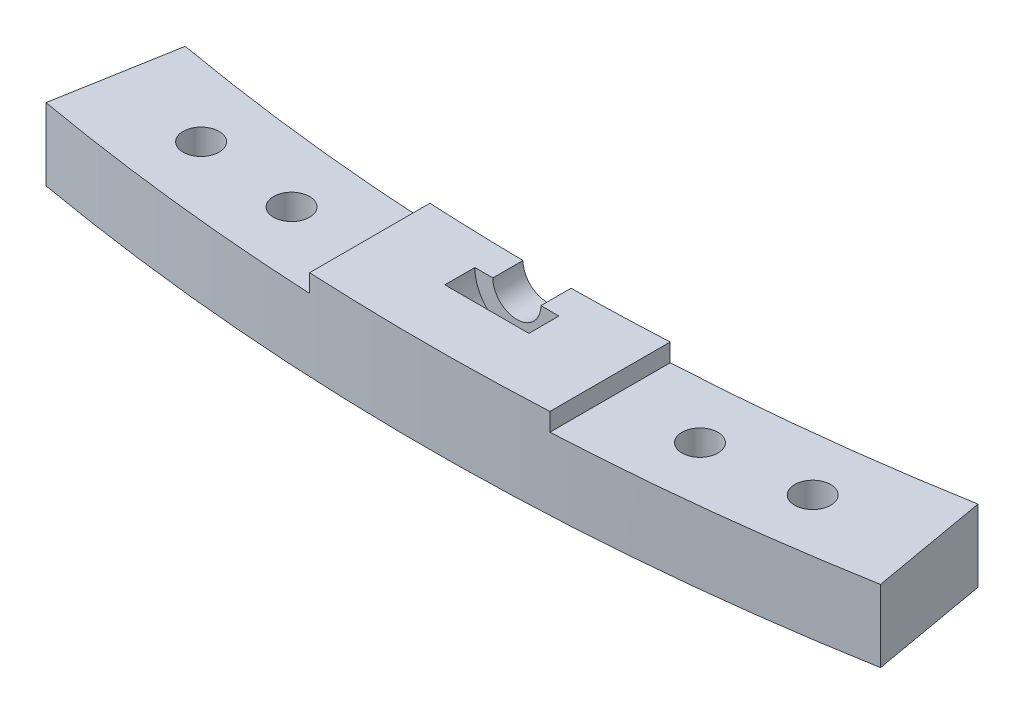
ISO-10303-21;
HEADER;
FILE_DESCRIPTION(('STEP AP214'),'2;1');
FILE_NAME('part.step','',(''),(''),'','','');
FILE_SCHEMA(('AUTOMOTIVE_DESIGN { 1 0 10303 214 1 1 1 1 }'));
ENDSEC;
DATA;
#1=APPLICATION_CONTEXT('core data for automotive mechanical design processes');
#2=APPLICATION_PROTOCOL_DEFINITION('international standard','automotive_design',2000,#1);
#3=PRODUCT_CONTEXT('',#1,'mechanical');
#4=PRODUCT('Part','Part','',(#3));
#5=PRODUCT_RELATED_PRODUCT_CATEGORY('part','',(#4));
#6=PRODUCT_DEFINITION_FORMATION('','',#4);
#7=PRODUCT_DEFINITION_CONTEXT('part definition',#1,'design');
#8=PRODUCT_DEFINITION('design','',#6,#7);
#9=PRODUCT_DEFINITION_SHAPE('','',#8);
#10=(LENGTH_UNIT() NAMED_UNIT(*) SI_UNIT(.MILLI.,.METRE.));
#11=(NAMED_UNIT(*) PLANE_ANGLE_UNIT() SI_UNIT($,.RADIAN.));
#12=(NAMED_UNIT(*) SI_UNIT($,.STERADIAN.) SOLID_ANGLE_UNIT());
#13=UNCERTAINTY_MEASURE_WITH_UNIT(LENGTH_MEASURE(1.E-05),#10,'distance_accuracy_value','');
#14=(GEOMETRIC_REPRESENTATION_CONTEXT(3) GLOBAL_UNCERTAINTY_ASSIGNED_CONTEXT((#13)) GLOBAL_UNIT_ASSIGNED_CONTEXT((#10,
#11,#12)) REPRESENTATION_CONTEXT('',''));
#15=CARTESIAN_POINT('',(0.,0.,0.));
#16=DIRECTION('',(0.,0.,1.));
#17=DIRECTION('',(1.,0.,0.));
#18=AXIS2_PLACEMENT_3D('',#15,#16,#17);
#19=CARTESIAN_POINT('',(0.,26.2710772670793,0.));
#20=DIRECTION('',(0.,-1.,0.));
#21=DIRECTION('',(0.,0.,-1.));
#22=AXIS2_PLACEMENT_3D('',#19,#20,#21);
#23=CYLINDRICAL_SURFACE('',#22,190.);
#24=CARTESIAN_POINT('',(0.,0.,0.));
#25=DIRECTION('',(0.,1.,0.));
#26=DIRECTION('',(0.,0.,1.));
#27=AXIS2_PLACEMENT_3D('',#24,#25,#26);
#28=CIRCLE('',#27,190.);
#29=CARTESIAN_POINT('',(-9.99999999999934,0.,189.736659610103));
#30=VERTEX_POINT('',#29);
#31=CARTESIAN_POINT('',(-2.00000000002216,0.,189.989473392606));
#32=VERTEX_POINT('',#31);
#33=EDGE_CURVE('E244',#30,#32,#28,.T.);
#34=ORIENTED_EDGE('',*,*,#33,.T.);
#35=CARTESIAN_POINT('',(-2.00000000002216,0.,189.989473392606));
#36=CARTESIAN_POINT('',(-1.9999996282867,-0.0562663615670697,189.989473252533));
#37=CARTESIAN_POINT('',(-1.99762408328803,-0.112505764435227,189.989498419835));
#38=CARTESIAN_POINT('',(-1.98814707857346,-0.224582125160615,189.989597884489));
#39=CARTESIAN_POINT('',(-1.98104584610246,-0.280419102238858,189.989672179479));
#40=CARTESIAN_POINT('',(-1.9527201409285,-0.446634438283064,189.989966219135));
#41=CARTESIAN_POINT('',(-1.92447347974323,-0.555899318345152,189.99025712777));
#42=CARTESIAN_POINT('',(-1.8500390294585,-0.768130642504423,189.990996429958));
#43=CARTESIAN_POINT('',(-1.80384293568367,-0.87109414557802,189.9914448964));
#44=CARTESIAN_POINT('',(-1.69482723839045,-1.06779909976538,189.992448587563));
#45=CARTESIAN_POINT('',(-1.63201088707611,-1.1615423501542,189.993003791393));
#46=CARTESIAN_POINT('',(-1.49153066181438,-1.33715494905182,189.994158476217));
#47=CARTESIAN_POINT('',(-1.41386594827158,-1.41902362565643,189.994757959713));
#48=CARTESIAN_POINT('',(-1.24588210957246,-1.56857411653775,189.995933689787));
#49=CARTESIAN_POINT('',(-1.15556105909845,-1.63625376842261,189.996509932812));
#50=CARTESIAN_POINT('',(-0.964839585091913,-1.75548636143188,189.997574101544));
#51=CARTESIAN_POINT('',(-0.864439372486534,-1.80703963994086,189.998062029099));
#52=CARTESIAN_POINT('',(-0.656414780417413,-1.89255529004982,189.998894541149));
#53=CARTESIAN_POINT('',(-0.548790865230986,-1.92651879094844,189.999239134845));
#54=CARTESIAN_POINT('',(-0.329370090691648,-1.9758949923209,189.999746170821));
#55=CARTESIAN_POINT('',(-0.217573302686825,-1.9913080098226,189.999908616214));
#56=CARTESIAN_POINT('',(0.00702380769235231,-2.00314676029534,190.0000330534));
#57=CARTESIAN_POINT('',(0.119824152817121,-1.99957206171852,189.999995040636));
#58=CARTESIAN_POINT('',(0.343217864650816,-1.97353655628363,189.999722843588));
#59=CARTESIAN_POINT('',(0.453811340457094,-1.9510766854003,189.999488669025));
#60=CARTESIAN_POINT('',(0.669657459518345,-1.88790988084822,189.998850561368));
#61=CARTESIAN_POINT('',(0.774910119007805,-1.84720300264864,189.998446628791));
#62=CARTESIAN_POINT('',(0.977092273388018,-1.74869571914981,189.997514517664));
#63=CARTESIAN_POINT('',(1.0740213822973,-1.69089452170088,189.996986333358));
#64=CARTESIAN_POINT('',(1.25679535801308,-1.55984282904133,189.99586530116));
#65=CARTESIAN_POINT('',(1.34264076627679,-1.48659308897844,189.995272456429));
#66=CARTESIAN_POINT('',(1.50080978823435,-1.32673038056564,189.994088959047));
#67=CARTESIAN_POINT('',(1.57313456063506,-1.24011855849687,189.993498306211));
#68=CARTESIAN_POINT('',(1.70223997665121,-1.0559479997299,189.992385539032));
#69=CARTESIAN_POINT('',(1.75901567425644,-0.958385793701042,189.991863446525));
#70=CARTESIAN_POINT('',(1.85540843690939,-0.755072219097268,189.990946609874));
#71=CARTESIAN_POINT('',(1.89501503452869,-0.649315901022155,189.990551943457));
#72=CARTESIAN_POINT('',(1.95585005946302,-0.432736835672161,189.989935500477));
#73=CARTESIAN_POINT('',(1.97710655557743,-0.321922100269124,189.989713459915));
#74=CARTESIAN_POINT('',(1.99261372162719,-0.175308953622074,189.989551013711));
#75=CARTESIAN_POINT('',(1.99538503861373,-0.1402736331387,189.98952192059));
#76=CARTESIAN_POINT('',(1.99907564906491,-0.0701636046164072,189.989483136031));
#77=CARTESIAN_POINT('',(1.99999799703702,-0.0350890574736384,189.989473412594));
#78=CARTESIAN_POINT('',(2.00000000002216,0.,189.989473392607));
#79=B_SPLINE_CURVE_WITH_KNOTS('',3,(#35,#36,#37,#38,#39,#40,#41,#42,#43,#44,#45,#46,#47,#48,#49,
#50,#51,#52,#53,#54,#55,#56,#57,#58,#59,#60,#61,#62,#63,#64,#65,#66,#67,#68,#69,#70,#71,#72,#73,
#74,#75,#76,#77,#78),.UNSPECIFIED.,.F.,.F.,(4,2,2,2,2,2,2,2,2,2,2,2,2,2,2,2,2,2,2,2,2,4),(0.,
0.168695399034471,0.33738268657242,0.674217866919582,1.01120907694378,1.34813439420536,
1.68507876842809,2.02207445533745,2.35906309138994,2.69603008941987,3.03299132860003,
3.36996022617985,3.70691242410866,4.04386359774195,4.38083038811888,4.7177807108739,
5.0547021440253,5.39173062447491,5.72896429196624,6.06568119925835,6.17108150078959,
6.27630753644634),.UNSPECIFIED.);
#80=CARTESIAN_POINT('',(2.00000000002216,0.,189.989473392606));
#81=VERTEX_POINT('',#80);
#82=EDGE_CURVE('E52',#32,#81,#79,.T.);
#83=ORIENTED_EDGE('',*,*,#82,.T.);
#84=CARTESIAN_POINT('',(10.0000000000013,0.,189.736659610103));
#85=VERTEX_POINT('',#84);
#86=EDGE_CURVE('E249',#81,#85,#28,.T.);
#87=ORIENTED_EDGE('',*,*,#86,.T.);
#88=DIRECTION('',(0.,-1.,0.));
#89=VECTOR('',#88,1.);
#90=CARTESIAN_POINT('',(10.0000000000013,22.4796831819073,189.736659610103));
#91=LINE('',#90,#89);
#92=CARTESIAN_POINT('',(10.0000000000013,-1.5,189.736659610103));
#93=VERTEX_POINT('',#92);
#94=EDGE_CURVE('E248',#85,#93,#91,.T.);
#95=ORIENTED_EDGE('',*,*,#94,.T.);
#96=CARTESIAN_POINT('',(0.,-1.5,0.));
#97=DIRECTION('',(0.,1.,0.));
#98=DIRECTION('',(0.,0.,1.));
#99=AXIS2_PLACEMENT_3D('',#96,#97,#98);
#100=CIRCLE('',#99,190.);
#101=CARTESIAN_POINT('',(32.9931537567169,-1.5,187.113473072319));
#102=VERTEX_POINT('',#101);
#103=EDGE_CURVE('E60',#93,#102,#100,.T.);
#104=ORIENTED_EDGE('',*,*,#103,.T.);
#105=DIRECTION('',(0.,-1.,0.));
#106=VECTOR('',#105,1.);
#107=CARTESIAN_POINT('',(32.9931537567169,26.2710772670793,187.11347307232));
#108=LINE('',#107,#106);
#109=CARTESIAN_POINT('',(32.9931537567169,-7.5,187.11347307232));
#110=VERTEX_POINT('',#109);
#111=EDGE_CURVE('E254',#102,#110,#108,.T.);
#112=ORIENTED_EDGE('',*,*,#111,.T.);
#113=CARTESIAN_POINT('',(0.,-7.5,0.));
#114=DIRECTION('',(0.,1.,0.));
#115=DIRECTION('',(0.,0.,1.));
#116=AXIS2_PLACEMENT_3D('',#113,#114,#115);
#117=CIRCLE('',#116,190.);
#118=CARTESIAN_POINT('',(-32.9931537567169,-7.5,187.11347307232));
#119=VERTEX_POINT('',#118);
#120=EDGE_CURVE('E272',#119,#110,#117,.T.);
#121=ORIENTED_EDGE('',*,*,#120,.F.);
#122=DIRECTION('',(0.,-1.,0.));
#123=VECTOR('',#122,1.);
#124=CARTESIAN_POINT('',(-32.9931537567169,26.2710772670793,187.11347307232));
#125=LINE('',#124,#123);
#126=CARTESIAN_POINT('',(-32.9931537567169,-1.5,187.11347307232));
#127=VERTEX_POINT('',#126);
#128=EDGE_CURVE('E277',#127,#119,#125,.T.);
#129=ORIENTED_EDGE('',*,*,#128,.F.);
#130=CARTESIAN_POINT('',(0.,-1.5,0.));
#131=DIRECTION('',(0.,1.,0.));
#132=DIRECTION('',(0.,0.,1.));
#133=AXIS2_PLACEMENT_3D('',#130,#131,#132);
#134=CIRCLE('',#133,190.);
#135=CARTESIAN_POINT('',(-9.99999999999934,-1.5,189.736659610103));
#136=VERTEX_POINT('',#135);
#137=EDGE_CURVE('E261',#127,#136,#134,.T.);
#138=ORIENTED_EDGE('',*,*,#137,.T.);
#139=DIRECTION('',(0.,-1.,0.));
#140=VECTOR('',#139,1.);
#141=CARTESIAN_POINT('',(-9.99999999999934,22.4796831819073,189.736659610103));
#142=LINE('',#141,#140);
#143=EDGE_CURVE('E246',#30,#136,#142,.T.);
#144=ORIENTED_EDGE('',*,*,#143,.F.);
#145=EDGE_LOOP('',(#34,#83,#87,#95,#104,#112,#121,#129,#138,#144));
#146=FACE_BOUND('',#145,.T.);
#147=ADVANCED_FACE('F35',(#146),#23,.F.);
#148=CARTESIAN_POINT('',(0.,0.,0.));
#149=DIRECTION('',(0.,1.,0.));
#150=DIRECTION('',(0.,0.,1.));
#151=AXIS2_PLACEMENT_3D('',#148,#149,#150);
#152=PLANE('',#151);
#153=ORIENTED_EDGE('',*,*,#86,.F.);
#154=DIRECTION('',(0.,0.,-1.));
#155=VECTOR('',#154,1.);
#156=CARTESIAN_POINT('',(2.00000000002216,0.,0.));
#157=LINE('',#156,#155);
#158=CARTESIAN_POINT('',(2.00000000004305,0.,192.500000000015));
#159=VERTEX_POINT('',#158);
#160=EDGE_CURVE('E11',#81,#159,#157,.F.);
#161=ORIENTED_EDGE('',*,*,#160,.T.);
#162=DIRECTION('',(1.,0.,0.));
#163=VECTOR('',#162,1.);
#164=CARTESIAN_POINT('',(0.,0.,192.500000000015));
#165=LINE('',#164,#163);
#166=CARTESIAN_POINT('',(3.49999999999995,0.,192.500000000015));
#167=VERTEX_POINT('',#166);
#168=EDGE_CURVE('E44',#159,#167,#165,.T.);
#169=ORIENTED_EDGE('',*,*,#168,.T.);
#170=DIRECTION('',(0.,0.,-1.));
#171=VECTOR('',#170,1.);
#172=CARTESIAN_POINT('',(3.49999999999995,0.,0.));
#173=LINE('',#172,#171);
#174=CARTESIAN_POINT('',(3.49999999999995,0.,195.000000000015));
#175=VERTEX_POINT('',#174);
#176=EDGE_CURVE('E151',#167,#175,#173,.F.);
#177=ORIENTED_EDGE('',*,*,#176,.T.);
#178=DIRECTION('',(-1.,0.,0.));
#179=VECTOR('',#178,1.);
#180=CARTESIAN_POINT('',(0.,0.,195.000000000015));
#181=LINE('',#180,#179);
#182=CARTESIAN_POINT('',(-3.49999999999995,0.,195.000000000015));
#183=VERTEX_POINT('',#182);
#184=EDGE_CURVE('E149',#175,#183,#181,.T.);
#185=ORIENTED_EDGE('',*,*,#184,.T.);
#186=DIRECTION('',(0.,0.,-1.));
#187=VECTOR('',#186,1.);
#188=CARTESIAN_POINT('',(-3.49999999999995,0.,0.));
#189=LINE('',#188,#187);
#190=CARTESIAN_POINT('',(-3.49999999999995,0.,192.500000000015));
#191=VERTEX_POINT('',#190);
#192=EDGE_CURVE('E147',#183,#191,#189,.T.);
#193=ORIENTED_EDGE('',*,*,#192,.T.);
#194=CARTESIAN_POINT('',(-2.00000000004305,0.,192.500000000015));
#195=VERTEX_POINT('',#194);
#196=EDGE_CURVE('E132',#191,#195,#165,.T.);
#197=ORIENTED_EDGE('',*,*,#196,.T.);
#198=DIRECTION('',(0.,0.,-1.));
#199=VECTOR('',#198,1.);
#200=CARTESIAN_POINT('',(-2.00000000002216,0.,0.));
#201=LINE('',#200,#199);
#202=EDGE_CURVE('E124',#195,#32,#201,.T.);
#203=ORIENTED_EDGE('',*,*,#202,.T.);
#204=ORIENTED_EDGE('',*,*,#33,.F.);
#205=DIRECTION('',(0.,0.,-1.));
#206=VECTOR('',#205,1.);
#207=CARTESIAN_POINT('',(-9.99999999999999,0.,0.));
#208=LINE('',#207,#206);
#209=CARTESIAN_POINT('',(-9.9999999999993,0.,199.749843554382));
#210=VERTEX_POINT('',#209);
#211=EDGE_CURVE('E252',#210,#30,#208,.T.);
#212=ORIENTED_EDGE('',*,*,#211,.F.);
#213=CARTESIAN_POINT('',(0.,0.,0.));
#214=DIRECTION('',(0.,1.,0.));
#215=DIRECTION('',(0.,0.,1.));
#216=AXIS2_PLACEMENT_3D('',#213,#214,#215);
#217=CIRCLE('',#216,200.);
#218=CARTESIAN_POINT('',(10.0000000000014,0.,199.749843554382));
#219=VERTEX_POINT('',#218);
#220=EDGE_CURVE('E262',#210,#219,#217,.T.);
#221=ORIENTED_EDGE('',*,*,#220,.T.);
#222=DIRECTION('',(0.,0.,-1.));
#223=VECTOR('',#222,1.);
#224=CARTESIAN_POINT('',(9.99999999999887,0.,-1.26468078935716E-13));
#225=LINE('',#224,#223);
#226=EDGE_CURVE('E258',#219,#85,#225,.T.);
#227=ORIENTED_EDGE('',*,*,#226,.T.);
#228=EDGE_LOOP('',(#153,#161,#169,#177,#185,#193,#197,#203,#204,#212,#221,#227));
#229=FACE_BOUND('',#228,.T.);
#230=ADVANCED_FACE('F145',(#229),#152,.T.);
#231=CARTESIAN_POINT('',(0.,26.2710772670793,0.));
#232=DIRECTION('',(0.984807753012208,0.,0.173648177666931));
#233=DIRECTION('',(0.173648177666931,0.,-0.984807753012208));
#234=AXIS2_PLACEMENT_3D('',#231,#232,#233);
#235=PLANE('',#234);
#236=DIRECTION('',(-0.173648177666931,0.,0.984807753012208));
#237=VECTOR('',#236,1.);
#238=CARTESIAN_POINT('',(0.,-1.5,0.));
#239=LINE('',#238,#237);
#240=CARTESIAN_POINT('',(-34.7296355333862,-1.5,196.961550602442));
#241=VERTEX_POINT('',#240);
#242=EDGE_CURVE('E279',#127,#241,#239,.T.);
#243=ORIENTED_EDGE('',*,*,#242,.F.);
#244=ORIENTED_EDGE('',*,*,#128,.T.);
#245=DIRECTION('',(-0.173648177666931,0.,0.984807753012208));
#246=VECTOR('',#245,1.);
#247=CARTESIAN_POINT('',(0.,-7.5,0.));
#248=LINE('',#247,#246);
#249=CARTESIAN_POINT('',(-34.7296355333862,-7.5,196.961550602442));
#250=VERTEX_POINT('',#249);
#251=EDGE_CURVE('E274',#119,#250,#248,.T.);
#252=ORIENTED_EDGE('',*,*,#251,.T.);
#253=DIRECTION('',(0.,-1.,0.));
#254=VECTOR('',#253,1.);
#255=CARTESIAN_POINT('',(-34.7296355333862,26.2710772670793,196.961550602442));
#256=LINE('',#255,#254);
#257=EDGE_CURVE('E273',#241,#250,#256,.T.);
#258=ORIENTED_EDGE('',*,*,#257,.F.);
#259=EDGE_LOOP('',(#243,#244,#252,#258));
#260=FACE_BOUND('',#259,.T.);
#261=ADVANCED_FACE('F228',(#260),#235,.F.);
#262=CARTESIAN_POINT('',(0.,26.2710772670793,0.));
#263=DIRECTION('',(0.,-1.,0.));
#264=DIRECTION('',(0.,0.,-1.));
#265=AXIS2_PLACEMENT_3D('',#262,#263,#264);
#266=CYLINDRICAL_SURFACE('',#265,200.);
#267=CARTESIAN_POINT('',(0.,-1.5,0.));
#268=DIRECTION('',(0.,1.,0.));
#269=DIRECTION('',(0.,0.,1.));
#270=AXIS2_PLACEMENT_3D('',#267,#268,#269);
#271=CIRCLE('',#270,200.);
#272=CARTESIAN_POINT('',(-9.9999999999993,-1.5,199.749843554382));
#273=VERTEX_POINT('',#272);
#274=EDGE_CURVE('E280',#241,#273,#271,.T.);
#275=ORIENTED_EDGE('',*,*,#274,.F.);
#276=ORIENTED_EDGE('',*,*,#257,.T.);
#277=CARTESIAN_POINT('',(0.,-7.5,0.));
#278=DIRECTION('',(0.,1.,0.));
#279=DIRECTION('',(0.,0.,1.));
#280=AXIS2_PLACEMENT_3D('',#277,#278,#279);
#281=CIRCLE('',#280,200.);
#282=CARTESIAN_POINT('',(34.7296355333862,-7.5,196.961550602442));
#283=VERTEX_POINT('',#282);
#284=EDGE_CURVE('E270',#250,#283,#281,.T.);
#285=ORIENTED_EDGE('',*,*,#284,.T.);
#286=DIRECTION('',(0.,-1.,0.));
#287=VECTOR('',#286,1.);
#288=CARTESIAN_POINT('',(34.7296355333862,26.2710772670793,196.961550602442));
#289=LINE('',#288,#287);
#290=CARTESIAN_POINT('',(34.7296355333862,-1.5,196.961550602442));
#291=VERTEX_POINT('',#290);
#292=EDGE_CURVE('E303',#291,#283,#289,.T.);
#293=ORIENTED_EDGE('',*,*,#292,.F.);
#294=CARTESIAN_POINT('',(0.,-1.5,0.));
#295=DIRECTION('',(0.,1.,0.));
#296=DIRECTION('',(0.,0.,1.));
#297=AXIS2_PLACEMENT_3D('',#294,#295,#296);
#298=CIRCLE('',#297,200.);
#299=CARTESIAN_POINT('',(10.0000000000014,-1.5,199.749843554382));
#300=VERTEX_POINT('',#299);
#301=EDGE_CURVE('E188',#300,#291,#298,.T.);
#302=ORIENTED_EDGE('',*,*,#301,.F.);
#303=DIRECTION('',(0.,-1.,0.));
#304=VECTOR('',#303,1.);
#305=CARTESIAN_POINT('',(10.0000000000014,22.4796831819073,199.749843554382));
#306=LINE('',#305,#304);
#307=EDGE_CURVE('E267',#219,#300,#306,.T.);
#308=ORIENTED_EDGE('',*,*,#307,.F.);
#309=ORIENTED_EDGE('',*,*,#220,.F.);
#310=DIRECTION('',(0.,-1.,0.));
#311=VECTOR('',#310,1.);
#312=CARTESIAN_POINT('',(-9.9999999999993,22.4796831819073,199.749843554382));
#313=LINE('',#312,#311);
#314=EDGE_CURVE('E264',#210,#273,#313,.T.);
#315=ORIENTED_EDGE('',*,*,#314,.T.);
#316=EDGE_LOOP('',(#275,#276,#285,#293,#302,#308,#309,#315));
#317=FACE_BOUND('',#316,.T.);
#318=ADVANCED_FACE('F232',(#317),#266,.T.);
#319=CARTESIAN_POINT('',(0.,-7.5,0.));
#320=DIRECTION('',(0.,1.,0.));
#321=DIRECTION('',(0.,0.,1.));
#322=AXIS2_PLACEMENT_3D('',#319,#320,#321);
#323=PLANE('',#322);
#324=CARTESIAN_POINT('',(25.4526074829101,-7.5,193.331747967893));
#325=DIRECTION('',(0.,1.,0.));
#326=DIRECTION('',(0.,0.,1.));
#327=AXIS2_PLACEMENT_3D('',#324,#325,#326);
#328=CIRCLE('',#327,1.49999999999998);
#329=CARTESIAN_POINT('',(25.4526074829101,-7.5,194.831747967893));
#330=VERTEX_POINT('',#329);
#331=EDGE_CURVE('E162',#330,#330,#328,.T.);
#332=ORIENTED_EDGE('',*,*,#331,.T.);
#333=EDGE_LOOP('',(#332));
#334=FACE_BOUND('',#333,.T.);
#335=CARTESIAN_POINT('',(-16.9953698357913,-7.5,194.257966127891));
#336=DIRECTION('',(0.,1.,0.));
#337=DIRECTION('',(0.,0.,1.));
#338=AXIS2_PLACEMENT_3D('',#335,#336,#337);
#339=CIRCLE('',#338,1.5);
#340=CARTESIAN_POINT('',(-16.9953698357913,-7.5,195.757966127891));
#341=VERTEX_POINT('',#340);
#342=EDGE_CURVE('E141',#341,#341,#339,.T.);
#343=ORIENTED_EDGE('',*,*,#342,.T.);
#344=EDGE_LOOP('',(#343));
#345=FACE_BOUND('',#344,.T.);
#346=CARTESIAN_POINT('',(-25.452607482908,-7.5,193.331747967893));
#347=DIRECTION('',(0.,1.,0.));
#348=DIRECTION('',(0.,0.,1.));
#349=AXIS2_PLACEMENT_3D('',#346,#347,#348);
#350=CIRCLE('',#349,1.49999999999998);
#351=CARTESIAN_POINT('',(-25.452607482908,-7.5,194.831747967893));
#352=VERTEX_POINT('',#351);
#353=EDGE_CURVE('E165',#352,#352,#350,.T.);
#354=ORIENTED_EDGE('',*,*,#353,.T.);
#355=EDGE_LOOP('',(#354));
#356=FACE_BOUND('',#355,.T.);
#357=CARTESIAN_POINT('',(16.9953698357934,-7.5,194.25796612789));
#358=DIRECTION('',(0.,1.,0.));
#359=DIRECTION('',(0.,0.,1.));
#360=AXIS2_PLACEMENT_3D('',#357,#358,#359);
#361=CIRCLE('',#360,1.49999999999998);
#362=CARTESIAN_POINT('',(16.9953698357934,-7.5,195.75796612789));
#363=VERTEX_POINT('',#362);
#364=EDGE_CURVE('E159',#363,#363,#361,.T.);
#365=ORIENTED_EDGE('',*,*,#364,.T.);
#366=EDGE_LOOP('',(#365));
#367=FACE_BOUND('',#366,.T.);
#368=ORIENTED_EDGE('',*,*,#120,.T.);
#369=DIRECTION('',(0.173648177666931,0.,0.984807753012208));
#370=VECTOR('',#369,1.);
#371=CARTESIAN_POINT('',(0.,-7.5,0.));
#372=LINE('',#371,#370);
#373=EDGE_CURVE('E189',#110,#283,#372,.T.);
#374=ORIENTED_EDGE('',*,*,#373,.T.);
#375=ORIENTED_EDGE('',*,*,#284,.F.);
#376=ORIENTED_EDGE('',*,*,#251,.F.);
#377=EDGE_LOOP('',(#368,#374,#375,#376));
#378=FACE_BOUND('',#377,.T.);
#379=ADVANCED_FACE('F229',(#334,#345,#356,#367,#378),#323,.F.);
#380=CARTESIAN_POINT('',(0.,-1.5,0.));
#381=DIRECTION('',(0.,1.,0.));
#382=DIRECTION('',(1.,0.,0.));
#383=AXIS2_PLACEMENT_3D('',#380,#381,#382);
#384=PLANE('',#383);
#385=CARTESIAN_POINT('',(-16.9953698357913,-1.5,194.257966127891));
#386=DIRECTION('',(0.,1.,0.));
#387=DIRECTION('',(0.,0.,1.));
#388=AXIS2_PLACEMENT_3D('',#385,#386,#387);
#389=CIRCLE('',#388,1.5);
#390=CARTESIAN_POINT('',(-16.9953698357913,-1.5,195.757966127891));
#391=VERTEX_POINT('',#390);
#392=EDGE_CURVE('E39',#391,#391,#389,.T.);
#393=ORIENTED_EDGE('',*,*,#392,.F.);
#394=EDGE_LOOP('',(#393));
#395=FACE_BOUND('',#394,.T.);
#396=CARTESIAN_POINT('',(-25.452607482908,-1.5,193.331747967893));
#397=DIRECTION('',(0.,1.,0.));
#398=DIRECTION('',(0.,0.,1.));
#399=AXIS2_PLACEMENT_3D('',#396,#397,#398);
#400=CIRCLE('',#399,1.49999999999998);
#401=CARTESIAN_POINT('',(-25.452607482908,-1.5,194.831747967893));
#402=VERTEX_POINT('',#401);
#403=EDGE_CURVE('E163',#402,#402,#400,.T.);
#404=ORIENTED_EDGE('',*,*,#403,.F.);
#405=EDGE_LOOP('',(#404));
#406=FACE_BOUND('',#405,.T.);
#407=ORIENTED_EDGE('',*,*,#137,.F.);
#408=ORIENTED_EDGE('',*,*,#242,.T.);
#409=ORIENTED_EDGE('',*,*,#274,.T.);
#410=DIRECTION('',(0.,0.,-1.));
#411=VECTOR('',#410,1.);
#412=CARTESIAN_POINT('',(-9.99999999999999,-1.5,0.));
#413=LINE('',#412,#411);
#414=EDGE_CURVE('E133',#273,#136,#413,.T.);
#415=ORIENTED_EDGE('',*,*,#414,.T.);
#416=EDGE_LOOP('',(#407,#408,#409,#415));
#417=FACE_BOUND('',#416,.T.);
#418=ADVANCED_FACE('F37',(#395,#406,#417),#384,.T.);
#419=CARTESIAN_POINT('',(-9.99999999999999,22.4796831819073,0.));
#420=DIRECTION('',(-1.,0.,0.));
#421=DIRECTION('',(0.,0.,1.));
#422=AXIS2_PLACEMENT_3D('',#419,#420,#421);
#423=PLANE('',#422);
#424=ORIENTED_EDGE('',*,*,#414,.F.);
#425=ORIENTED_EDGE('',*,*,#314,.F.);
#426=ORIENTED_EDGE('',*,*,#211,.T.);
#427=ORIENTED_EDGE('',*,*,#143,.T.);
#428=EDGE_LOOP('',(#424,#425,#426,#427));
#429=FACE_BOUND('',#428,.T.);
#430=ADVANCED_FACE('F221',(#429),#423,.T.);
#431=CARTESIAN_POINT('',(9.99999999999887,22.4796831819073,-1.26468078935716E-13));
#432=DIRECTION('',(-1.,0.,0.));
#433=DIRECTION('',(0.,0.,1.));
#434=AXIS2_PLACEMENT_3D('',#431,#432,#433);
#435=PLANE('',#434);
#436=ORIENTED_EDGE('',*,*,#307,.T.);
#437=DIRECTION('',(0.,0.,-1.));
#438=VECTOR('',#437,1.);
#439=CARTESIAN_POINT('',(9.99999999999887,-1.5,-1.26468078935716E-13));
#440=LINE('',#439,#438);
#441=EDGE_CURVE('E308',#300,#93,#440,.T.);
#442=ORIENTED_EDGE('',*,*,#441,.T.);
#443=ORIENTED_EDGE('',*,*,#94,.F.);
#444=ORIENTED_EDGE('',*,*,#226,.F.);
#445=EDGE_LOOP('',(#436,#442,#443,#444));
#446=FACE_BOUND('',#445,.T.);
#447=ADVANCED_FACE('F217',(#446),#435,.F.);
#448=CARTESIAN_POINT('',(0.,-1.5,0.));
#449=DIRECTION('',(0.,1.,0.));
#450=DIRECTION('',(1.,0.,0.));
#451=AXIS2_PLACEMENT_3D('',#448,#449,#450);
#452=PLANE('',#451);
#453=CARTESIAN_POINT('',(25.4526074829101,-1.5,193.331747967893));
#454=DIRECTION('',(0.,1.,0.));
#455=DIRECTION('',(0.,0.,1.));
#456=AXIS2_PLACEMENT_3D('',#453,#454,#455);
#457=CIRCLE('',#456,1.49999999999998);
#458=CARTESIAN_POINT('',(25.4526074829101,-1.5,194.831747967893));
#459=VERTEX_POINT('',#458);
#460=EDGE_CURVE('E160',#459,#459,#457,.T.);
#461=ORIENTED_EDGE('',*,*,#460,.F.);
#462=EDGE_LOOP('',(#461));
#463=FACE_BOUND('',#462,.T.);
#464=CARTESIAN_POINT('',(16.9953698357934,-1.5,194.25796612789));
#465=DIRECTION('',(0.,1.,0.));
#466=DIRECTION('',(0.,0.,1.));
#467=AXIS2_PLACEMENT_3D('',#464,#465,#466);
#468=CIRCLE('',#467,1.49999999999998);
#469=CARTESIAN_POINT('',(16.9953698357934,-1.5,195.75796612789));
#470=VERTEX_POINT('',#469);
#471=EDGE_CURVE('E156',#470,#470,#468,.T.);
#472=ORIENTED_EDGE('',*,*,#471,.F.);
#473=EDGE_LOOP('',(#472));
#474=FACE_BOUND('',#473,.T.);
#475=ORIENTED_EDGE('',*,*,#103,.F.);
#476=ORIENTED_EDGE('',*,*,#441,.F.);
#477=ORIENTED_EDGE('',*,*,#301,.T.);
#478=DIRECTION('',(0.173648177666931,0.,0.984807753012208));
#479=VECTOR('',#478,1.);
#480=CARTESIAN_POINT('',(0.,-1.5,0.));
#481=LINE('',#480,#479);
#482=EDGE_CURVE('E301',#102,#291,#481,.T.);
#483=ORIENTED_EDGE('',*,*,#482,.F.);
#484=EDGE_LOOP('',(#475,#476,#477,#483));
#485=FACE_BOUND('',#484,.T.);
#486=ADVANCED_FACE('F213',(#463,#474,#485),#452,.T.);
#487=CARTESIAN_POINT('',(0.,26.2710772670793,0.));
#488=DIRECTION('',(0.984807753012208,0.,-0.173648177666931));
#489=DIRECTION('',(-0.173648177666931,0.,-0.984807753012208));
#490=AXIS2_PLACEMENT_3D('',#487,#488,#489);
#491=PLANE('',#490);
#492=ORIENTED_EDGE('',*,*,#111,.F.);
#493=ORIENTED_EDGE('',*,*,#482,.T.);
#494=ORIENTED_EDGE('',*,*,#292,.T.);
#495=ORIENTED_EDGE('',*,*,#373,.F.);
#496=EDGE_LOOP('',(#492,#493,#494,#495));
#497=FACE_BOUND('',#496,.T.);
#498=ADVANCED_FACE('F209',(#497),#491,.T.);
#499=CARTESIAN_POINT('',(3.49999999999995,0.,195.000000000015));
#500=DIRECTION('',(0.,0.,-1.));
#501=DIRECTION('',(-1.,0.,0.));
#502=AXIS2_PLACEMENT_3D('',#499,#500,#501);
#503=PLANE('',#502);
#504=CARTESIAN_POINT('',(0.,0.,195.000000000015));
#505=DIRECTION('',(0.,0.,-1.));
#506=DIRECTION('',(-1.,0.,0.));
#507=AXIS2_PLACEMENT_3D('',#504,#505,#506);
#508=CIRCLE('',#507,3.49999999999995);
#509=EDGE_CURVE('E179',#175,#183,#508,.T.);
#510=ORIENTED_EDGE('',*,*,#509,.T.);
#511=ORIENTED_EDGE('',*,*,#184,.F.);
#512=EDGE_LOOP('',(#510,#511));
#513=FACE_BOUND('',#512,.T.);
#514=ADVANCED_FACE('F205',(#513),#503,.T.);
#515=CARTESIAN_POINT('',(0.,0.,0.));
#516=DIRECTION('',(0.,0.,-1.));
#517=DIRECTION('',(-1.,0.,0.));
#518=AXIS2_PLACEMENT_3D('',#515,#516,#517);
#519=CYLINDRICAL_SURFACE('',#518,3.49999999999995);
#520=CARTESIAN_POINT('',(0.,0.,192.500000000015));
#521=DIRECTION('',(0.,0.,-1.));
#522=DIRECTION('',(-1.,0.,0.));
#523=AXIS2_PLACEMENT_3D('',#520,#521,#522);
#524=CIRCLE('',#523,3.49999999999995);
#525=EDGE_CURVE('E140',#167,#191,#524,.T.);
#526=ORIENTED_EDGE('',*,*,#525,.T.);
#527=ORIENTED_EDGE('',*,*,#192,.F.);
#528=ORIENTED_EDGE('',*,*,#509,.F.);
#529=ORIENTED_EDGE('',*,*,#176,.F.);
#530=EDGE_LOOP('',(#526,#527,#528,#529));
#531=FACE_BOUND('',#530,.T.);
#532=ADVANCED_FACE('F202',(#531),#519,.F.);
#533=CARTESIAN_POINT('',(3.49999999999995,0.,192.500000000015));
#534=DIRECTION('',(0.,0.,1.));
#535=DIRECTION('',(1.,0.,0.));
#536=AXIS2_PLACEMENT_3D('',#533,#534,#535);
#537=PLANE('',#536);
#538=ORIENTED_EDGE('',*,*,#525,.F.);
#539=ORIENTED_EDGE('',*,*,#168,.F.);
#540=CARTESIAN_POINT('',(0.,0.,192.500000000015));
#541=DIRECTION('',(0.,0.,-1.));
#542=DIRECTION('',(-1.,0.,0.));
#543=AXIS2_PLACEMENT_3D('',#540,#541,#542);
#544=CIRCLE('',#543,2.00000000004305);
#545=EDGE_CURVE('E127',#159,#195,#544,.T.);
#546=ORIENTED_EDGE('',*,*,#545,.T.);
#547=ORIENTED_EDGE('',*,*,#196,.F.);
#548=EDGE_LOOP('',(#538,#539,#546,#547));
#549=FACE_BOUND('',#548,.T.);
#550=ADVANCED_FACE('F137',(#549),#537,.T.);
#551=CARTESIAN_POINT('',(0.,0.,0.));
#552=DIRECTION('',(0.,0.,-1.));
#553=DIRECTION('',(-1.,0.,0.));
#554=AXIS2_PLACEMENT_3D('',#551,#552,#553);
#555=CYLINDRICAL_SURFACE('',#554,2.00000000002216);
#556=ORIENTED_EDGE('',*,*,#82,.F.);
#557=ORIENTED_EDGE('',*,*,#202,.F.);
#558=ORIENTED_EDGE('',*,*,#545,.F.);
#559=ORIENTED_EDGE('',*,*,#160,.F.);
#560=EDGE_LOOP('',(#556,#557,#558,#559));
#561=FACE_BOUND('',#560,.T.);
#562=ADVANCED_FACE('F126',(#561),#555,.F.);
#563=CARTESIAN_POINT('',(16.9953698357934,0.112750824070942,194.25796612789));
#564=DIRECTION('',(0.,-1.,0.));
#565=DIRECTION('',(0.,0.,-1.));
#566=AXIS2_PLACEMENT_3D('',#563,#564,#565);
#567=CYLINDRICAL_SURFACE('',#566,1.49999999999998);
#568=ORIENTED_EDGE('',*,*,#471,.T.);
#569=EDGE_LOOP('',(#568));
#570=FACE_BOUND('',#569,.T.);
#571=ORIENTED_EDGE('',*,*,#364,.F.);
#572=EDGE_LOOP('',(#571));
#573=FACE_BOUND('',#572,.T.);
#574=ADVANCED_FACE('F197',(#570,#573),#567,.F.);
#575=CARTESIAN_POINT('',(25.4526074829101,0.112750824070942,193.331747967893));
#576=DIRECTION('',(0.,-1.,0.));
#577=DIRECTION('',(0.,0.,-1.));
#578=AXIS2_PLACEMENT_3D('',#575,#576,#577);
#579=CYLINDRICAL_SURFACE('',#578,1.49999999999998);
#580=ORIENTED_EDGE('',*,*,#460,.T.);
#581=EDGE_LOOP('',(#580));
#582=FACE_BOUND('',#581,.T.);
#583=ORIENTED_EDGE('',*,*,#331,.F.);
#584=EDGE_LOOP('',(#583));
#585=FACE_BOUND('',#584,.T.);
#586=ADVANCED_FACE('F338',(#582,#585),#579,.F.);
#587=CARTESIAN_POINT('',(-25.452607482908,0.112750824070942,193.331747967893));
#588=DIRECTION('',(0.,-1.,0.));
#589=DIRECTION('',(0.,0.,-1.));
#590=AXIS2_PLACEMENT_3D('',#587,#588,#589);
#591=CYLINDRICAL_SURFACE('',#590,1.49999999999998);
#592=ORIENTED_EDGE('',*,*,#403,.T.);
#593=EDGE_LOOP('',(#592));
#594=FACE_BOUND('',#593,.T.);
#595=ORIENTED_EDGE('',*,*,#353,.F.);
#596=EDGE_LOOP('',(#595));
#597=FACE_BOUND('',#596,.T.);
#598=ADVANCED_FACE('F198',(#594,#597),#591,.F.);
#599=CARTESIAN_POINT('',(-16.9953698357913,0.112750824070942,194.257966127891));
#600=DIRECTION('',(0.,-1.,0.));
#601=DIRECTION('',(0.,0.,-1.));
#602=AXIS2_PLACEMENT_3D('',#599,#600,#601);
#603=CYLINDRICAL_SURFACE('',#602,1.5);
#604=ORIENTED_EDGE('',*,*,#392,.T.);
#605=EDGE_LOOP('',(#604));
#606=FACE_BOUND('',#605,.T.);
#607=ORIENTED_EDGE('',*,*,#342,.F.);
#608=EDGE_LOOP('',(#607));
#609=FACE_BOUND('',#608,.T.);
#610=ADVANCED_FACE('F325',(#606,#609),#603,.F.);
#611=CLOSED_SHELL('',(#147,#230,#261,#318,#379,#418,#430,#447,#486,#498,#514,#532,#550,#562,
#574,#586,#598,#610));
#612=MANIFOLD_SOLID_BREP('B2',#611);
#613=ADVANCED_BREP_SHAPE_REPRESENTATION('',(#18,#612),#14);
#614=SHAPE_DEFINITION_REPRESENTATION(#9,#613);
ENDSEC;
END-ISO-10303-21;
